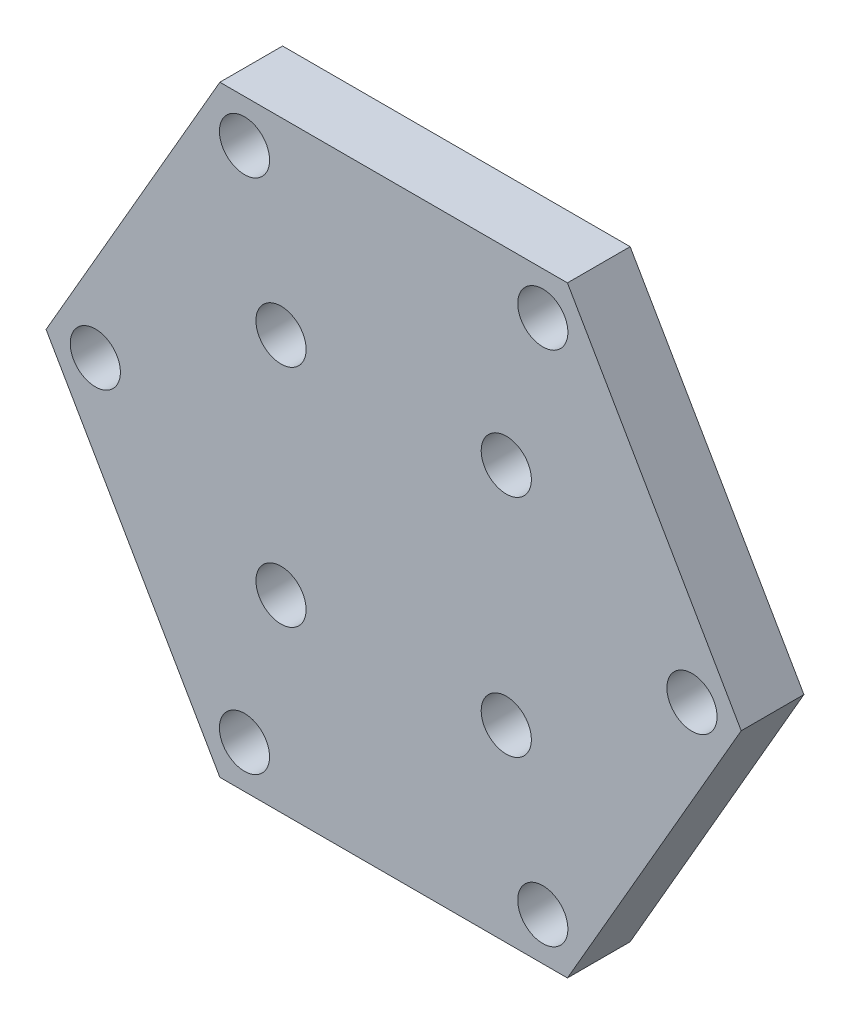
ISO-10303-21;
HEADER;
FILE_DESCRIPTION(('STEP AP214'),'2;1');
FILE_NAME('part.step','',(''),(''),'','','');
FILE_SCHEMA(('AUTOMOTIVE_DESIGN { 1 0 10303 214 1 1 1 1 }'));
ENDSEC;
DATA;
#1=APPLICATION_CONTEXT('core data for automotive mechanical design processes');
#2=APPLICATION_PROTOCOL_DEFINITION('international standard','automotive_design',2000,#1);
#3=PRODUCT_CONTEXT('',#1,'mechanical');
#4=PRODUCT('Part','Part','',(#3));
#5=PRODUCT_RELATED_PRODUCT_CATEGORY('part','',(#4));
#6=PRODUCT_DEFINITION_FORMATION('','',#4);
#7=PRODUCT_DEFINITION_CONTEXT('part definition',#1,'design');
#8=PRODUCT_DEFINITION('design','',#6,#7);
#9=PRODUCT_DEFINITION_SHAPE('','',#8);
#10=(LENGTH_UNIT() NAMED_UNIT(*) SI_UNIT(.MILLI.,.METRE.));
#11=(NAMED_UNIT(*) PLANE_ANGLE_UNIT() SI_UNIT($,.RADIAN.));
#12=(NAMED_UNIT(*) SI_UNIT($,.STERADIAN.) SOLID_ANGLE_UNIT());
#13=UNCERTAINTY_MEASURE_WITH_UNIT(LENGTH_MEASURE(1.E-05),#10,'distance_accuracy_value','');
#14=(GEOMETRIC_REPRESENTATION_CONTEXT(3) GLOBAL_UNCERTAINTY_ASSIGNED_CONTEXT((#13)) GLOBAL_UNIT_ASSIGNED_CONTEXT((#10,
#11,#12)) REPRESENTATION_CONTEXT('',''));
#15=CARTESIAN_POINT('',(0.,0.,0.));
#16=DIRECTION('',(0.,0.,1.));
#17=DIRECTION('',(1.,0.,0.));
#18=AXIS2_PLACEMENT_3D('',#15,#16,#17);
#19=CARTESIAN_POINT('',(13.856406460551,24.,5.));
#20=DIRECTION('',(0.,-1.,0.));
#21=DIRECTION('',(0.,0.,-1.));
#22=AXIS2_PLACEMENT_3D('',#19,#20,#21);
#23=PLANE('',#22);
#24=DIRECTION('',(-1.,0.,0.));
#25=VECTOR('',#24,1.);
#26=CARTESIAN_POINT('',(13.856406460551,24.,0.));
#27=LINE('',#26,#25);
#28=CARTESIAN_POINT('',(13.856406460551,24.,0.));
#29=VERTEX_POINT('',#28);
#30=CARTESIAN_POINT('',(-13.856406460551,24.,0.));
#31=VERTEX_POINT('',#30);
#32=EDGE_CURVE('E122',#29,#31,#27,.T.);
#33=ORIENTED_EDGE('',*,*,#32,.T.);
#34=DIRECTION('',(0.,0.,-1.));
#35=VECTOR('',#34,1.);
#36=CARTESIAN_POINT('',(-13.856406460551,24.,5.));
#37=LINE('',#36,#35);
#38=CARTESIAN_POINT('',(-13.856406460551,24.,5.));
#39=VERTEX_POINT('',#38);
#40=EDGE_CURVE('E11',#39,#31,#37,.T.);
#41=ORIENTED_EDGE('',*,*,#40,.F.);
#42=DIRECTION('',(-1.,0.,0.));
#43=VECTOR('',#42,1.);
#44=CARTESIAN_POINT('',(13.856406460551,24.,5.));
#45=LINE('',#44,#43);
#46=CARTESIAN_POINT('',(13.856406460551,24.,5.));
#47=VERTEX_POINT('',#46);
#48=EDGE_CURVE('E133',#47,#39,#45,.T.);
#49=ORIENTED_EDGE('',*,*,#48,.F.);
#50=DIRECTION('',(0.,0.,-1.));
#51=VECTOR('',#50,1.);
#52=CARTESIAN_POINT('',(13.856406460551,24.,5.));
#53=LINE('',#52,#51);
#54=EDGE_CURVE('E118',#47,#29,#53,.T.);
#55=ORIENTED_EDGE('',*,*,#54,.T.);
#56=EDGE_LOOP('',(#33,#41,#49,#55));
#57=FACE_BOUND('',#56,.T.);
#58=ADVANCED_FACE('F38',(#57),#23,.F.);
#59=CARTESIAN_POINT('',(-13.856406460551,24.,5.));
#60=DIRECTION('',(0.866025403784439,-0.5,0.));
#61=DIRECTION('',(0.5,0.866025403784439,0.));
#62=AXIS2_PLACEMENT_3D('',#59,#60,#61);
#63=PLANE('',#62);
#64=DIRECTION('',(-0.5,-0.866025403784439,0.));
#65=VECTOR('',#64,1.);
#66=CARTESIAN_POINT('',(-13.856406460551,24.,0.));
#67=LINE('',#66,#65);
#68=CARTESIAN_POINT('',(-27.712812921102,0.,0.));
#69=VERTEX_POINT('',#68);
#70=EDGE_CURVE('E125',#31,#69,#67,.T.);
#71=ORIENTED_EDGE('',*,*,#70,.T.);
#72=DIRECTION('',(0.,0.,-1.));
#73=VECTOR('',#72,1.);
#74=CARTESIAN_POINT('',(-27.712812921102,0.,5.));
#75=LINE('',#74,#73);
#76=CARTESIAN_POINT('',(-27.712812921102,0.,5.));
#77=VERTEX_POINT('',#76);
#78=EDGE_CURVE('E46',#77,#69,#75,.T.);
#79=ORIENTED_EDGE('',*,*,#78,.F.);
#80=DIRECTION('',(-0.5,-0.866025403784439,0.));
#81=VECTOR('',#80,1.);
#82=CARTESIAN_POINT('',(-13.856406460551,24.,5.));
#83=LINE('',#82,#81);
#84=EDGE_CURVE('E91',#39,#77,#83,.T.);
#85=ORIENTED_EDGE('',*,*,#84,.F.);
#86=ORIENTED_EDGE('',*,*,#40,.T.);
#87=EDGE_LOOP('',(#71,#79,#85,#86));
#88=FACE_BOUND('',#87,.T.);
#89=ADVANCED_FACE('F159',(#88),#63,.F.);
#90=CARTESIAN_POINT('',(-27.712812921102,0.,5.));
#91=DIRECTION('',(0.866025403784439,0.5,0.));
#92=DIRECTION('',(-0.5,0.866025403784439,0.));
#93=AXIS2_PLACEMENT_3D('',#90,#91,#92);
#94=PLANE('',#93);
#95=DIRECTION('',(0.5,-0.866025403784439,0.));
#96=VECTOR('',#95,1.);
#97=CARTESIAN_POINT('',(-27.712812921102,0.,0.));
#98=LINE('',#97,#96);
#99=CARTESIAN_POINT('',(-13.856406460551,-24.,0.));
#100=VERTEX_POINT('',#99);
#101=EDGE_CURVE('E128',#69,#100,#98,.T.);
#102=ORIENTED_EDGE('',*,*,#101,.T.);
#103=DIRECTION('',(0.,0.,-1.));
#104=VECTOR('',#103,1.);
#105=CARTESIAN_POINT('',(-13.856406460551,-24.,5.));
#106=LINE('',#105,#104);
#107=CARTESIAN_POINT('',(-13.856406460551,-24.,5.));
#108=VERTEX_POINT('',#107);
#109=EDGE_CURVE('E113',#108,#100,#106,.T.);
#110=ORIENTED_EDGE('',*,*,#109,.F.);
#111=DIRECTION('',(0.5,-0.866025403784439,0.));
#112=VECTOR('',#111,1.);
#113=CARTESIAN_POINT('',(-27.712812921102,0.,5.));
#114=LINE('',#113,#112);
#115=EDGE_CURVE('E104',#77,#108,#114,.T.);
#116=ORIENTED_EDGE('',*,*,#115,.F.);
#117=ORIENTED_EDGE('',*,*,#78,.T.);
#118=EDGE_LOOP('',(#102,#110,#116,#117));
#119=FACE_BOUND('',#118,.T.);
#120=ADVANCED_FACE('F139',(#119),#94,.F.);
#121=CARTESIAN_POINT('',(-13.856406460551,-24.,5.));
#122=DIRECTION('',(0.,1.,0.));
#123=DIRECTION('',(-1.,0.,0.));
#124=AXIS2_PLACEMENT_3D('',#121,#122,#123);
#125=PLANE('',#124);
#126=DIRECTION('',(1.,0.,0.));
#127=VECTOR('',#126,1.);
#128=CARTESIAN_POINT('',(-13.856406460551,-24.,0.));
#129=LINE('',#128,#127);
#130=CARTESIAN_POINT('',(13.856406460551,-24.,0.));
#131=VERTEX_POINT('',#130);
#132=EDGE_CURVE('E112',#100,#131,#129,.T.);
#133=ORIENTED_EDGE('',*,*,#132,.T.);
#134=DIRECTION('',(0.,0.,-1.));
#135=VECTOR('',#134,1.);
#136=CARTESIAN_POINT('',(13.856406460551,-24.,5.));
#137=LINE('',#136,#135);
#138=CARTESIAN_POINT('',(13.856406460551,-24.,5.));
#139=VERTEX_POINT('',#138);
#140=EDGE_CURVE('E109',#139,#131,#137,.T.);
#141=ORIENTED_EDGE('',*,*,#140,.F.);
#142=DIRECTION('',(1.,0.,0.));
#143=VECTOR('',#142,1.);
#144=CARTESIAN_POINT('',(-13.856406460551,-24.,5.));
#145=LINE('',#144,#143);
#146=EDGE_CURVE('E98',#108,#139,#145,.T.);
#147=ORIENTED_EDGE('',*,*,#146,.F.);
#148=ORIENTED_EDGE('',*,*,#109,.T.);
#149=EDGE_LOOP('',(#133,#141,#147,#148));
#150=FACE_BOUND('',#149,.T.);
#151=ADVANCED_FACE('F110',(#150),#125,.F.);
#152=CARTESIAN_POINT('',(13.856406460551,-24.,5.));
#153=DIRECTION('',(-0.866025403784439,0.5,0.));
#154=DIRECTION('',(-0.5,-0.866025403784439,0.));
#155=AXIS2_PLACEMENT_3D('',#152,#153,#154);
#156=PLANE('',#155);
#157=DIRECTION('',(0.5,0.866025403784439,0.));
#158=VECTOR('',#157,1.);
#159=CARTESIAN_POINT('',(13.856406460551,-24.,0.));
#160=LINE('',#159,#158);
#161=CARTESIAN_POINT('',(27.712812921102,0.,0.));
#162=VERTEX_POINT('',#161);
#163=EDGE_CURVE('E77',#131,#162,#160,.T.);
#164=ORIENTED_EDGE('',*,*,#163,.T.);
#165=DIRECTION('',(0.,0.,-1.));
#166=VECTOR('',#165,1.);
#167=CARTESIAN_POINT('',(27.712812921102,0.,5.));
#168=LINE('',#167,#166);
#169=CARTESIAN_POINT('',(27.712812921102,0.,5.));
#170=VERTEX_POINT('',#169);
#171=EDGE_CURVE('E114',#170,#162,#168,.T.);
#172=ORIENTED_EDGE('',*,*,#171,.F.);
#173=DIRECTION('',(0.5,0.866025403784439,0.));
#174=VECTOR('',#173,1.);
#175=CARTESIAN_POINT('',(13.856406460551,-24.,5.));
#176=LINE('',#175,#174);
#177=EDGE_CURVE('E102',#139,#170,#176,.T.);
#178=ORIENTED_EDGE('',*,*,#177,.F.);
#179=ORIENTED_EDGE('',*,*,#140,.T.);
#180=EDGE_LOOP('',(#164,#172,#178,#179));
#181=FACE_BOUND('',#180,.T.);
#182=ADVANCED_FACE('F116',(#181),#156,.F.);
#183=CARTESIAN_POINT('',(27.712812921102,0.,5.));
#184=DIRECTION('',(-0.866025403784439,-0.5,0.));
#185=DIRECTION('',(0.5,-0.866025403784439,0.));
#186=AXIS2_PLACEMENT_3D('',#183,#184,#185);
#187=PLANE('',#186);
#188=DIRECTION('',(-0.5,0.866025403784439,0.));
#189=VECTOR('',#188,1.);
#190=CARTESIAN_POINT('',(27.712812921102,0.,0.));
#191=LINE('',#190,#189);
#192=EDGE_CURVE('E83',#162,#29,#191,.T.);
#193=ORIENTED_EDGE('',*,*,#192,.T.);
#194=ORIENTED_EDGE('',*,*,#54,.F.);
#195=DIRECTION('',(-0.5,0.866025403784439,0.));
#196=VECTOR('',#195,1.);
#197=CARTESIAN_POINT('',(27.712812921102,0.,5.));
#198=LINE('',#197,#196);
#199=EDGE_CURVE('E54',#170,#47,#198,.T.);
#200=ORIENTED_EDGE('',*,*,#199,.F.);
#201=ORIENTED_EDGE('',*,*,#171,.T.);
#202=EDGE_LOOP('',(#193,#194,#200,#201));
#203=FACE_BOUND('',#202,.T.);
#204=ADVANCED_FACE('F146',(#203),#187,.F.);
#205=CARTESIAN_POINT('',(0.,0.,5.));
#206=DIRECTION('',(0.,0.,1.));
#207=DIRECTION('',(1.,0.,0.));
#208=AXIS2_PLACEMENT_3D('',#205,#206,#207);
#209=PLANE('',#208);
#210=CARTESIAN_POINT('',(11.8934155453063,20.6,5.));
#211=DIRECTION('',(0.,0.,1.));
#212=DIRECTION('',(1.,0.,0.));
#213=AXIS2_PLACEMENT_3D('',#210,#211,#212);
#214=CIRCLE('',#213,1.99999999999999);
#215=CARTESIAN_POINT('',(13.8934155453063,20.6,5.));
#216=VERTEX_POINT('',#215);
#217=EDGE_CURVE('E325',#216,#216,#214,.T.);
#218=ORIENTED_EDGE('',*,*,#217,.F.);
#219=EDGE_LOOP('',(#218));
#220=FACE_BOUND('',#219,.T.);
#221=CARTESIAN_POINT('',(-11.8934155453063,20.6,5.));
#222=DIRECTION('',(0.,0.,1.));
#223=DIRECTION('',(1.,0.,0.));
#224=AXIS2_PLACEMENT_3D('',#221,#222,#223);
#225=CIRCLE('',#224,1.99999999999999);
#226=CARTESIAN_POINT('',(-9.8934155453063,20.6,5.));
#227=VERTEX_POINT('',#226);
#228=EDGE_CURVE('E327',#227,#227,#225,.T.);
#229=ORIENTED_EDGE('',*,*,#228,.F.);
#230=EDGE_LOOP('',(#229));
#231=FACE_BOUND('',#230,.T.);
#232=CARTESIAN_POINT('',(-23.7868310906126,0.,5.));
#233=DIRECTION('',(0.,0.,1.));
#234=DIRECTION('',(1.,0.,0.));
#235=AXIS2_PLACEMENT_3D('',#232,#233,#234);
#236=CIRCLE('',#235,1.99999999999999);
#237=CARTESIAN_POINT('',(-21.7868310906126,0.,5.));
#238=VERTEX_POINT('',#237);
#239=EDGE_CURVE('E335',#238,#238,#236,.T.);
#240=ORIENTED_EDGE('',*,*,#239,.F.);
#241=EDGE_LOOP('',(#240));
#242=FACE_BOUND('',#241,.T.);
#243=CARTESIAN_POINT('',(11.8934155453063,-20.6,5.));
#244=DIRECTION('',(0.,0.,1.));
#245=DIRECTION('',(1.,0.,0.));
#246=AXIS2_PLACEMENT_3D('',#243,#244,#245);
#247=CIRCLE('',#246,1.99999999999999);
#248=CARTESIAN_POINT('',(13.8934155453063,-20.6,5.));
#249=VERTEX_POINT('',#248);
#250=EDGE_CURVE('E341',#249,#249,#247,.T.);
#251=ORIENTED_EDGE('',*,*,#250,.F.);
#252=EDGE_LOOP('',(#251));
#253=FACE_BOUND('',#252,.T.);
#254=CARTESIAN_POINT('',(-11.8934155453063,-20.6,5.));
#255=DIRECTION('',(0.,0.,1.));
#256=DIRECTION('',(1.,0.,0.));
#257=AXIS2_PLACEMENT_3D('',#254,#255,#256);
#258=CIRCLE('',#257,1.99999999999999);
#259=CARTESIAN_POINT('',(-9.89341554530631,-20.6,5.));
#260=VERTEX_POINT('',#259);
#261=EDGE_CURVE('E347',#260,#260,#258,.T.);
#262=ORIENTED_EDGE('',*,*,#261,.F.);
#263=EDGE_LOOP('',(#262));
#264=FACE_BOUND('',#263,.T.);
#265=CARTESIAN_POINT('',(23.7868310906126,0.,5.));
#266=DIRECTION('',(0.,0.,1.));
#267=DIRECTION('',(1.,0.,0.));
#268=AXIS2_PLACEMENT_3D('',#265,#266,#267);
#269=CIRCLE('',#268,1.99999999999999);
#270=CARTESIAN_POINT('',(25.7868310906126,0.,5.));
#271=VERTEX_POINT('',#270);
#272=EDGE_CURVE('E353',#271,#271,#269,.T.);
#273=ORIENTED_EDGE('',*,*,#272,.F.);
#274=EDGE_LOOP('',(#273));
#275=FACE_BOUND('',#274,.T.);
#276=CARTESIAN_POINT('',(8.98025612106923,8.98025612106923,5.));
#277=DIRECTION('',(0.,0.,-1.));
#278=DIRECTION('',(-1.,0.,0.));
#279=AXIS2_PLACEMENT_3D('',#276,#277,#278);
#280=CIRCLE('',#279,2.);
#281=CARTESIAN_POINT('',(6.98025612106923,8.98025612106923,5.));
#282=VERTEX_POINT('',#281);
#283=EDGE_CURVE('E362',#282,#282,#280,.T.);
#284=ORIENTED_EDGE('',*,*,#283,.T.);
#285=EDGE_LOOP('',(#284));
#286=FACE_BOUND('',#285,.T.);
#287=CARTESIAN_POINT('',(8.98025612106922,-8.98025612106923,5.));
#288=DIRECTION('',(0.,0.,-1.));
#289=DIRECTION('',(-1.,0.,0.));
#290=AXIS2_PLACEMENT_3D('',#287,#288,#289);
#291=CIRCLE('',#290,2.);
#292=CARTESIAN_POINT('',(6.98025612106922,-8.98025612106923,5.));
#293=VERTEX_POINT('',#292);
#294=EDGE_CURVE('E368',#293,#293,#291,.T.);
#295=ORIENTED_EDGE('',*,*,#294,.T.);
#296=EDGE_LOOP('',(#295));
#297=FACE_BOUND('',#296,.T.);
#298=CARTESIAN_POINT('',(-8.98025612106923,-8.98025612106923,5.));
#299=DIRECTION('',(0.,0.,-1.));
#300=DIRECTION('',(-1.,0.,0.));
#301=AXIS2_PLACEMENT_3D('',#298,#299,#300);
#302=CIRCLE('',#301,2.);
#303=CARTESIAN_POINT('',(-10.9802561210692,-8.98025612106923,5.));
#304=VERTEX_POINT('',#303);
#305=EDGE_CURVE('E374',#304,#304,#302,.T.);
#306=ORIENTED_EDGE('',*,*,#305,.T.);
#307=EDGE_LOOP('',(#306));
#308=FACE_BOUND('',#307,.T.);
#309=CARTESIAN_POINT('',(-8.98025612106922,8.98025612106923,5.));
#310=DIRECTION('',(0.,0.,-1.));
#311=DIRECTION('',(-1.,0.,0.));
#312=AXIS2_PLACEMENT_3D('',#309,#310,#311);
#313=CIRCLE('',#312,2.);
#314=CARTESIAN_POINT('',(-10.9802561210692,8.98025612106923,5.));
#315=VERTEX_POINT('',#314);
#316=EDGE_CURVE('E380',#315,#315,#313,.T.);
#317=ORIENTED_EDGE('',*,*,#316,.T.);
#318=EDGE_LOOP('',(#317));
#319=FACE_BOUND('',#318,.T.);
#320=ORIENTED_EDGE('',*,*,#48,.T.);
#321=ORIENTED_EDGE('',*,*,#84,.T.);
#322=ORIENTED_EDGE('',*,*,#115,.T.);
#323=ORIENTED_EDGE('',*,*,#146,.T.);
#324=ORIENTED_EDGE('',*,*,#177,.T.);
#325=ORIENTED_EDGE('',*,*,#199,.T.);
#326=EDGE_LOOP('',(#320,#321,#322,#323,#324,#325));
#327=FACE_BOUND('',#326,.T.);
#328=ADVANCED_FACE('F100',(#220,#231,#242,#253,#264,#275,#286,#297,#308,#319,#327),#209,.T.);
#329=CARTESIAN_POINT('',(0.,0.,0.));
#330=DIRECTION('',(0.,0.,1.));
#331=DIRECTION('',(1.,0.,0.));
#332=AXIS2_PLACEMENT_3D('',#329,#330,#331);
#333=PLANE('',#332);
#334=CARTESIAN_POINT('',(11.8934155453063,20.6,0.));
#335=DIRECTION('',(0.,0.,1.));
#336=DIRECTION('',(1.,0.,0.));
#337=AXIS2_PLACEMENT_3D('',#334,#335,#336);
#338=CIRCLE('',#337,2.);
#339=CARTESIAN_POINT('',(13.8934155453063,20.6,0.));
#340=VERTEX_POINT('',#339);
#341=EDGE_CURVE('E322',#340,#340,#338,.T.);
#342=ORIENTED_EDGE('',*,*,#341,.T.);
#343=EDGE_LOOP('',(#342));
#344=FACE_BOUND('',#343,.T.);
#345=CARTESIAN_POINT('',(-11.8934155453063,20.6,0.));
#346=DIRECTION('',(0.,0.,1.));
#347=DIRECTION('',(1.,0.,0.));
#348=AXIS2_PLACEMENT_3D('',#345,#346,#347);
#349=CIRCLE('',#348,2.);
#350=CARTESIAN_POINT('',(-9.89341554530629,20.6,0.));
#351=VERTEX_POINT('',#350);
#352=EDGE_CURVE('E332',#351,#351,#349,.T.);
#353=ORIENTED_EDGE('',*,*,#352,.T.);
#354=EDGE_LOOP('',(#353));
#355=FACE_BOUND('',#354,.T.);
#356=CARTESIAN_POINT('',(-23.7868310906126,0.,0.));
#357=DIRECTION('',(0.,0.,1.));
#358=DIRECTION('',(1.,0.,0.));
#359=AXIS2_PLACEMENT_3D('',#356,#357,#358);
#360=CIRCLE('',#359,2.);
#361=CARTESIAN_POINT('',(-21.7868310906126,0.,0.));
#362=VERTEX_POINT('',#361);
#363=EDGE_CURVE('E338',#362,#362,#360,.T.);
#364=ORIENTED_EDGE('',*,*,#363,.T.);
#365=EDGE_LOOP('',(#364));
#366=FACE_BOUND('',#365,.T.);
#367=CARTESIAN_POINT('',(11.8934155453063,-20.6,0.));
#368=DIRECTION('',(0.,0.,1.));
#369=DIRECTION('',(1.,0.,0.));
#370=AXIS2_PLACEMENT_3D('',#367,#368,#369);
#371=CIRCLE('',#370,2.);
#372=CARTESIAN_POINT('',(13.8934155453063,-20.6,0.));
#373=VERTEX_POINT('',#372);
#374=EDGE_CURVE('E344',#373,#373,#371,.T.);
#375=ORIENTED_EDGE('',*,*,#374,.T.);
#376=EDGE_LOOP('',(#375));
#377=FACE_BOUND('',#376,.T.);
#378=CARTESIAN_POINT('',(-11.8934155453063,-20.6,0.));
#379=DIRECTION('',(0.,0.,1.));
#380=DIRECTION('',(1.,0.,0.));
#381=AXIS2_PLACEMENT_3D('',#378,#379,#380);
#382=CIRCLE('',#381,2.);
#383=CARTESIAN_POINT('',(-9.8934155453063,-20.6,0.));
#384=VERTEX_POINT('',#383);
#385=EDGE_CURVE('E350',#384,#384,#382,.T.);
#386=ORIENTED_EDGE('',*,*,#385,.T.);
#387=EDGE_LOOP('',(#386));
#388=FACE_BOUND('',#387,.T.);
#389=CARTESIAN_POINT('',(23.7868310906126,0.,0.));
#390=DIRECTION('',(0.,0.,1.));
#391=DIRECTION('',(1.,0.,0.));
#392=AXIS2_PLACEMENT_3D('',#389,#390,#391);
#393=CIRCLE('',#392,2.);
#394=CARTESIAN_POINT('',(25.7868310906126,0.,0.));
#395=VERTEX_POINT('',#394);
#396=EDGE_CURVE('E356',#395,#395,#393,.T.);
#397=ORIENTED_EDGE('',*,*,#396,.T.);
#398=EDGE_LOOP('',(#397));
#399=FACE_BOUND('',#398,.T.);
#400=CARTESIAN_POINT('',(0.,0.,0.));
#401=DIRECTION('',(0.,0.,-1.));
#402=DIRECTION('',(-1.,0.,0.));
#403=AXIS2_PLACEMENT_3D('',#400,#401,#402);
#404=CIRCLE('',#403,21.35);
#405=CARTESIAN_POINT('',(-21.35,0.,0.));
#406=VERTEX_POINT('',#405);
#407=EDGE_CURVE('E383',#406,#406,#404,.T.);
#408=ORIENTED_EDGE('',*,*,#407,.F.);
#409=EDGE_LOOP('',(#408));
#410=FACE_BOUND('',#409,.T.);
#411=ORIENTED_EDGE('',*,*,#32,.F.);
#412=ORIENTED_EDGE('',*,*,#192,.F.);
#413=ORIENTED_EDGE('',*,*,#163,.F.);
#414=ORIENTED_EDGE('',*,*,#132,.F.);
#415=ORIENTED_EDGE('',*,*,#101,.F.);
#416=ORIENTED_EDGE('',*,*,#70,.F.);
#417=EDGE_LOOP('',(#411,#412,#413,#414,#415,#416));
#418=FACE_BOUND('',#417,.T.);
#419=ADVANCED_FACE('F142',(#344,#355,#366,#377,#388,#399,#410,#418),#333,.F.);
#420=CARTESIAN_POINT('',(0.,0.,1.));
#421=DIRECTION('',(0.,0.,-1.));
#422=DIRECTION('',(-1.,0.,0.));
#423=AXIS2_PLACEMENT_3D('',#420,#421,#422);
#424=CYLINDRICAL_SURFACE('',#423,21.35);
#425=CARTESIAN_POINT('',(0.,0.,1.));
#426=DIRECTION('',(0.,0.,-1.));
#427=DIRECTION('',(-1.,0.,0.));
#428=AXIS2_PLACEMENT_3D('',#425,#426,#427);
#429=CIRCLE('',#428,21.35);
#430=CARTESIAN_POINT('',(-21.35,0.,1.));
#431=VERTEX_POINT('',#430);
#432=EDGE_CURVE('E126',#431,#431,#429,.T.);
#433=ORIENTED_EDGE('',*,*,#432,.F.);
#434=EDGE_LOOP('',(#433));
#435=FACE_BOUND('',#434,.T.);
#436=ORIENTED_EDGE('',*,*,#407,.T.);
#437=EDGE_LOOP('',(#436));
#438=FACE_BOUND('',#437,.T.);
#439=ADVANCED_FACE('F199',(#435,#438),#424,.F.);
#440=CARTESIAN_POINT('',(0.,0.,1.));
#441=DIRECTION('',(0.,0.,-1.));
#442=DIRECTION('',(-1.,0.,0.));
#443=AXIS2_PLACEMENT_3D('',#440,#441,#442);
#444=PLANE('',#443);
#445=CARTESIAN_POINT('',(8.98025612106923,8.98025612106923,0.999999999999999));
#446=DIRECTION('',(0.,0.,-1.));
#447=DIRECTION('',(-1.,0.,0.));
#448=AXIS2_PLACEMENT_3D('',#445,#446,#447);
#449=CIRCLE('',#448,1.99999999999999);
#450=CARTESIAN_POINT('',(6.98025612106924,8.98025612106923,0.999999999999999));
#451=VERTEX_POINT('',#450);
#452=EDGE_CURVE('E359',#451,#451,#449,.T.);
#453=ORIENTED_EDGE('',*,*,#452,.F.);
#454=EDGE_LOOP('',(#453));
#455=FACE_BOUND('',#454,.T.);
#456=CARTESIAN_POINT('',(8.98025612106922,-8.98025612106923,0.999999999999999));
#457=DIRECTION('',(0.,0.,-1.));
#458=DIRECTION('',(-1.,0.,0.));
#459=AXIS2_PLACEMENT_3D('',#456,#457,#458);
#460=CIRCLE('',#459,1.99999999999999);
#461=CARTESIAN_POINT('',(6.98025612106923,-8.98025612106923,0.999999999999999));
#462=VERTEX_POINT('',#461);
#463=EDGE_CURVE('E365',#462,#462,#460,.T.);
#464=ORIENTED_EDGE('',*,*,#463,.F.);
#465=EDGE_LOOP('',(#464));
#466=FACE_BOUND('',#465,.T.);
#467=CARTESIAN_POINT('',(-8.98025612106923,-8.98025612106923,0.999999999999999));
#468=DIRECTION('',(0.,0.,-1.));
#469=DIRECTION('',(-1.,0.,0.));
#470=AXIS2_PLACEMENT_3D('',#467,#468,#469);
#471=CIRCLE('',#470,1.99999999999999);
#472=CARTESIAN_POINT('',(-10.9802561210692,-8.98025612106923,0.999999999999999));
#473=VERTEX_POINT('',#472);
#474=EDGE_CURVE('E371',#473,#473,#471,.T.);
#475=ORIENTED_EDGE('',*,*,#474,.F.);
#476=EDGE_LOOP('',(#475));
#477=FACE_BOUND('',#476,.T.);
#478=CARTESIAN_POINT('',(-8.98025612106922,8.98025612106923,0.999999999999999));
#479=DIRECTION('',(0.,0.,-1.));
#480=DIRECTION('',(-1.,0.,0.));
#481=AXIS2_PLACEMENT_3D('',#478,#479,#480);
#482=CIRCLE('',#481,1.99999999999999);
#483=CARTESIAN_POINT('',(-10.9802561210692,8.98025612106923,0.999999999999999));
#484=VERTEX_POINT('',#483);
#485=EDGE_CURVE('E377',#484,#484,#482,.T.);
#486=ORIENTED_EDGE('',*,*,#485,.F.);
#487=EDGE_LOOP('',(#486));
#488=FACE_BOUND('',#487,.T.);
#489=ORIENTED_EDGE('',*,*,#432,.T.);
#490=EDGE_LOOP('',(#489));
#491=FACE_BOUND('',#490,.T.);
#492=ADVANCED_FACE('F208',(#455,#466,#477,#488,#491),#444,.T.);
#493=CARTESIAN_POINT('',(-8.98025612106922,8.98025612106923,1.));
#494=DIRECTION('',(0.,0.,-1.));
#495=DIRECTION('',(-1.,0.,0.));
#496=AXIS2_PLACEMENT_3D('',#493,#494,#495);
#497=CYLINDRICAL_SURFACE('',#496,1.99999999999999);
#498=ORIENTED_EDGE('',*,*,#316,.F.);
#499=EDGE_LOOP('',(#498));
#500=FACE_BOUND('',#499,.T.);
#501=ORIENTED_EDGE('',*,*,#485,.T.);
#502=EDGE_LOOP('',(#501));
#503=FACE_BOUND('',#502,.T.);
#504=ADVANCED_FACE('F218',(#500,#503),#497,.F.);
#505=CARTESIAN_POINT('',(-8.98025612106923,-8.98025612106923,1.));
#506=DIRECTION('',(0.,0.,-1.));
#507=DIRECTION('',(-1.,0.,0.));
#508=AXIS2_PLACEMENT_3D('',#505,#506,#507);
#509=CYLINDRICAL_SURFACE('',#508,1.99999999999999);
#510=ORIENTED_EDGE('',*,*,#305,.F.);
#511=EDGE_LOOP('',(#510));
#512=FACE_BOUND('',#511,.T.);
#513=ORIENTED_EDGE('',*,*,#474,.T.);
#514=EDGE_LOOP('',(#513));
#515=FACE_BOUND('',#514,.T.);
#516=ADVANCED_FACE('F228',(#512,#515),#509,.F.);
#517=CARTESIAN_POINT('',(8.98025612106922,-8.98025612106923,1.));
#518=DIRECTION('',(0.,0.,-1.));
#519=DIRECTION('',(-1.,0.,0.));
#520=AXIS2_PLACEMENT_3D('',#517,#518,#519);
#521=CYLINDRICAL_SURFACE('',#520,1.99999999999999);
#522=ORIENTED_EDGE('',*,*,#294,.F.);
#523=EDGE_LOOP('',(#522));
#524=FACE_BOUND('',#523,.T.);
#525=ORIENTED_EDGE('',*,*,#463,.T.);
#526=EDGE_LOOP('',(#525));
#527=FACE_BOUND('',#526,.T.);
#528=ADVANCED_FACE('F238',(#524,#527),#521,.F.);
#529=CARTESIAN_POINT('',(8.98025612106923,8.98025612106923,1.));
#530=DIRECTION('',(0.,0.,-1.));
#531=DIRECTION('',(-1.,0.,0.));
#532=AXIS2_PLACEMENT_3D('',#529,#530,#531);
#533=CYLINDRICAL_SURFACE('',#532,1.99999999999999);
#534=ORIENTED_EDGE('',*,*,#283,.F.);
#535=EDGE_LOOP('',(#534));
#536=FACE_BOUND('',#535,.T.);
#537=ORIENTED_EDGE('',*,*,#452,.T.);
#538=EDGE_LOOP('',(#537));
#539=FACE_BOUND('',#538,.T.);
#540=ADVANCED_FACE('F248',(#536,#539),#533,.F.);
#541=CARTESIAN_POINT('',(23.7868310906126,0.,5.));
#542=DIRECTION('',(0.,0.,1.));
#543=DIRECTION('',(1.,0.,0.));
#544=AXIS2_PLACEMENT_3D('',#541,#542,#543);
#545=CYLINDRICAL_SURFACE('',#544,1.99999999999999);
#546=ORIENTED_EDGE('',*,*,#396,.F.);
#547=EDGE_LOOP('',(#546));
#548=FACE_BOUND('',#547,.T.);
#549=ORIENTED_EDGE('',*,*,#272,.T.);
#550=EDGE_LOOP('',(#549));
#551=FACE_BOUND('',#550,.T.);
#552=ADVANCED_FACE('F257',(#548,#551),#545,.F.);
#553=CARTESIAN_POINT('',(-11.8934155453063,-20.6,5.));
#554=DIRECTION('',(0.,0.,1.));
#555=DIRECTION('',(1.,0.,0.));
#556=AXIS2_PLACEMENT_3D('',#553,#554,#555);
#557=CYLINDRICAL_SURFACE('',#556,1.99999999999999);
#558=ORIENTED_EDGE('',*,*,#385,.F.);
#559=EDGE_LOOP('',(#558));
#560=FACE_BOUND('',#559,.T.);
#561=ORIENTED_EDGE('',*,*,#261,.T.);
#562=EDGE_LOOP('',(#561));
#563=FACE_BOUND('',#562,.T.);
#564=ADVANCED_FACE('F266',(#560,#563),#557,.F.);
#565=CARTESIAN_POINT('',(11.8934155453063,-20.6,5.));
#566=DIRECTION('',(0.,0.,1.));
#567=DIRECTION('',(1.,0.,0.));
#568=AXIS2_PLACEMENT_3D('',#565,#566,#567);
#569=CYLINDRICAL_SURFACE('',#568,1.99999999999999);
#570=ORIENTED_EDGE('',*,*,#374,.F.);
#571=EDGE_LOOP('',(#570));
#572=FACE_BOUND('',#571,.T.);
#573=ORIENTED_EDGE('',*,*,#250,.T.);
#574=EDGE_LOOP('',(#573));
#575=FACE_BOUND('',#574,.T.);
#576=ADVANCED_FACE('F276',(#572,#575),#569,.F.);
#577=CARTESIAN_POINT('',(-23.7868310906126,0.,5.));
#578=DIRECTION('',(0.,0.,1.));
#579=DIRECTION('',(1.,0.,0.));
#580=AXIS2_PLACEMENT_3D('',#577,#578,#579);
#581=CYLINDRICAL_SURFACE('',#580,1.99999999999999);
#582=ORIENTED_EDGE('',*,*,#363,.F.);
#583=EDGE_LOOP('',(#582));
#584=FACE_BOUND('',#583,.T.);
#585=ORIENTED_EDGE('',*,*,#239,.T.);
#586=EDGE_LOOP('',(#585));
#587=FACE_BOUND('',#586,.T.);
#588=ADVANCED_FACE('F286',(#584,#587),#581,.F.);
#589=CARTESIAN_POINT('',(-11.8934155453063,20.6,5.));
#590=DIRECTION('',(0.,0.,1.));
#591=DIRECTION('',(1.,0.,0.));
#592=AXIS2_PLACEMENT_3D('',#589,#590,#591);
#593=CYLINDRICAL_SURFACE('',#592,1.99999999999999);
#594=ORIENTED_EDGE('',*,*,#352,.F.);
#595=EDGE_LOOP('',(#594));
#596=FACE_BOUND('',#595,.T.);
#597=ORIENTED_EDGE('',*,*,#228,.T.);
#598=EDGE_LOOP('',(#597));
#599=FACE_BOUND('',#598,.T.);
#600=ADVANCED_FACE('F296',(#596,#599),#593,.F.);
#601=CARTESIAN_POINT('',(11.8934155453063,20.6,5.));
#602=DIRECTION('',(0.,0.,1.));
#603=DIRECTION('',(1.,0.,0.));
#604=AXIS2_PLACEMENT_3D('',#601,#602,#603);
#605=CYLINDRICAL_SURFACE('',#604,1.99999999999999);
#606=ORIENTED_EDGE('',*,*,#341,.F.);
#607=EDGE_LOOP('',(#606));
#608=FACE_BOUND('',#607,.T.);
#609=ORIENTED_EDGE('',*,*,#217,.T.);
#610=EDGE_LOOP('',(#609));
#611=FACE_BOUND('',#610,.T.);
#612=ADVANCED_FACE('F306',(#608,#611),#605,.F.);
#613=CLOSED_SHELL('',(#58,#89,#120,#151,#182,#204,#328,#419,#439,#492,#504,#516,#528,#540,#552,
#564,#576,#588,#600,#612));
#614=MANIFOLD_SOLID_BREP('B2',#613);
#615=ADVANCED_BREP_SHAPE_REPRESENTATION('',(#18,#614),#14);
#616=SHAPE_DEFINITION_REPRESENTATION(#9,#615);
ENDSEC;
END-ISO-10303-21;
